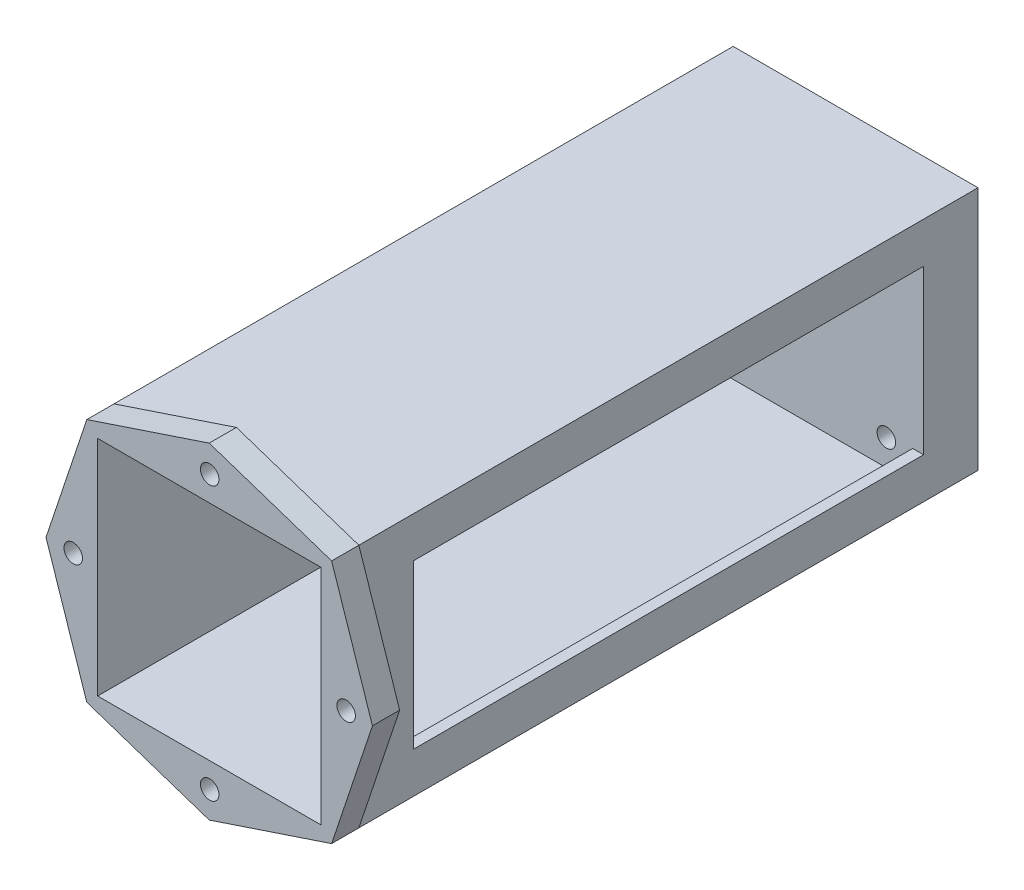
ISO-10303-21;
HEADER;
FILE_DESCRIPTION(('STEP AP214'),'2;1');
FILE_NAME('part.step','',(''),(''),'','','');
FILE_SCHEMA(('AUTOMOTIVE_DESIGN { 1 0 10303 214 1 1 1 1 }'));
ENDSEC;
DATA;
#1=APPLICATION_CONTEXT('core data for automotive mechanical design processes');
#2=APPLICATION_PROTOCOL_DEFINITION('international standard','automotive_design',2000,#1);
#3=PRODUCT_CONTEXT('',#1,'mechanical');
#4=PRODUCT('Part','Part','',(#3));
#5=PRODUCT_RELATED_PRODUCT_CATEGORY('part','',(#4));
#6=PRODUCT_DEFINITION_FORMATION('','',#4);
#7=PRODUCT_DEFINITION_CONTEXT('part definition',#1,'design');
#8=PRODUCT_DEFINITION('design','',#6,#7);
#9=PRODUCT_DEFINITION_SHAPE('','',#8);
#10=(LENGTH_UNIT() NAMED_UNIT(*) SI_UNIT(.MILLI.,.METRE.));
#11=(NAMED_UNIT(*) PLANE_ANGLE_UNIT() SI_UNIT($,.RADIAN.));
#12=(NAMED_UNIT(*) SI_UNIT($,.STERADIAN.) SOLID_ANGLE_UNIT());
#13=UNCERTAINTY_MEASURE_WITH_UNIT(LENGTH_MEASURE(1.E-05),#10,'distance_accuracy_value','');
#14=(GEOMETRIC_REPRESENTATION_CONTEXT(3) GLOBAL_UNCERTAINTY_ASSIGNED_CONTEXT((#13)) GLOBAL_UNIT_ASSIGNED_CONTEXT((#10,
#11,#12)) REPRESENTATION_CONTEXT('',''));
#15=CARTESIAN_POINT('',(0.,0.,0.));
#16=DIRECTION('',(0.,0.,1.));
#17=DIRECTION('',(1.,0.,0.));
#18=AXIS2_PLACEMENT_3D('',#15,#16,#17);
#19=CARTESIAN_POINT('',(0.,0.,-5.));
#20=DIRECTION('',(0.,0.,-1.));
#21=DIRECTION('',(-1.,0.,0.));
#22=AXIS2_PLACEMENT_3D('',#19,#20,#21);
#23=PLANE('',#22);
#24=DIRECTION('',(0.,-1.,0.));
#25=VECTOR('',#24,1.);
#26=CARTESIAN_POINT('',(22.5,22.5,-5.));
#27=LINE('',#26,#25);
#28=CARTESIAN_POINT('',(22.5,22.5,-5.));
#29=VERTEX_POINT('',#28);
#30=CARTESIAN_POINT('',(22.5,-22.5,-5.));
#31=VERTEX_POINT('',#30);
#32=EDGE_CURVE('E174',#29,#31,#27,.T.);
#33=ORIENTED_EDGE('',*,*,#32,.F.);
#34=DIRECTION('',(-0.316227766016838,0.948683298050514,0.));
#35=VECTOR('',#34,1.);
#36=CARTESIAN_POINT('',(22.5,22.5,-5.));
#37=LINE('',#36,#35);
#38=CARTESIAN_POINT('',(30.,0.,-5.));
#39=VERTEX_POINT('',#38);
#40=EDGE_CURVE('E320',#39,#29,#37,.T.);
#41=ORIENTED_EDGE('',*,*,#40,.F.);
#42=DIRECTION('',(0.316227766016838,0.948683298050514,0.));
#43=VECTOR('',#42,1.);
#44=CARTESIAN_POINT('',(30.,0.,-5.));
#45=LINE('',#44,#43);
#46=EDGE_CURVE('E317',#31,#39,#45,.T.);
#47=ORIENTED_EDGE('',*,*,#46,.F.);
#48=EDGE_LOOP('',(#33,#41,#47));
#49=FACE_BOUND('',#48,.T.);
#50=CARTESIAN_POINT('',(25.1687006688977,0.,-5.));
#51=DIRECTION('',(0.,0.,1.));
#52=DIRECTION('',(1.,0.,0.));
#53=AXIS2_PLACEMENT_3D('',#50,#51,#52);
#54=CIRCLE('',#53,1.7);
#55=CARTESIAN_POINT('',(26.8687006688977,0.,-5.));
#56=VERTEX_POINT('',#55);
#57=EDGE_CURVE('E286',#56,#56,#54,.T.);
#58=ORIENTED_EDGE('',*,*,#57,.T.);
#59=EDGE_LOOP('',(#58));
#60=FACE_BOUND('',#59,.T.);
#61=ADVANCED_FACE('F39',(#49,#60),#23,.T.);
#62=DIRECTION('',(1.,0.,0.));
#63=VECTOR('',#62,1.);
#64=CARTESIAN_POINT('',(-22.5,22.5,-5.));
#65=LINE('',#64,#63);
#66=CARTESIAN_POINT('',(-22.5,22.5,-5.));
#67=VERTEX_POINT('',#66);
#68=EDGE_CURVE('E269',#67,#29,#65,.T.);
#69=ORIENTED_EDGE('',*,*,#68,.F.);
#70=DIRECTION('',(-0.948683298050514,-0.316227766016838,0.));
#71=VECTOR('',#70,1.);
#72=CARTESIAN_POINT('',(-22.5,22.5,-5.));
#73=LINE('',#72,#71);
#74=CARTESIAN_POINT('',(0.,30.,-5.));
#75=VERTEX_POINT('',#74);
#76=EDGE_CURVE('E302',#75,#67,#73,.T.);
#77=ORIENTED_EDGE('',*,*,#76,.F.);
#78=DIRECTION('',(-0.948683298050514,0.316227766016838,0.));
#79=VECTOR('',#78,1.);
#80=CARTESIAN_POINT('',(0.,30.,-5.));
#81=LINE('',#80,#79);
#82=EDGE_CURVE('E323',#29,#75,#81,.T.);
#83=ORIENTED_EDGE('',*,*,#82,.F.);
#84=EDGE_LOOP('',(#69,#77,#83));
#85=FACE_BOUND('',#84,.T.);
#86=CARTESIAN_POINT('',(0.0843503344486113,25.0843503344489,-5.));
#87=DIRECTION('',(0.,0.,1.));
#88=DIRECTION('',(1.,0.,0.));
#89=AXIS2_PLACEMENT_3D('',#86,#87,#88);
#90=CIRCLE('',#89,1.7);
#91=CARTESIAN_POINT('',(1.78435033444861,25.0843503344489,-5.));
#92=VERTEX_POINT('',#91);
#93=EDGE_CURVE('E280',#92,#92,#90,.T.);
#94=ORIENTED_EDGE('',*,*,#93,.T.);
#95=EDGE_LOOP('',(#94));
#96=FACE_BOUND('',#95,.T.);
#97=ADVANCED_FACE('F418',(#85,#96),#23,.T.);
#98=DIRECTION('',(0.,1.,0.));
#99=VECTOR('',#98,1.);
#100=CARTESIAN_POINT('',(-22.5,22.5,-5.));
#101=LINE('',#100,#99);
#102=CARTESIAN_POINT('',(-22.5,-22.5,-5.));
#103=VERTEX_POINT('',#102);
#104=EDGE_CURVE('E266',#103,#67,#101,.T.);
#105=ORIENTED_EDGE('',*,*,#104,.F.);
#106=DIRECTION('',(0.316227766016838,-0.948683298050514,0.));
#107=VECTOR('',#106,1.);
#108=CARTESIAN_POINT('',(-22.5,-22.5,-5.));
#109=LINE('',#108,#107);
#110=CARTESIAN_POINT('',(-30.,0.,-5.));
#111=VERTEX_POINT('',#110);
#112=EDGE_CURVE('E309',#111,#103,#109,.T.);
#113=ORIENTED_EDGE('',*,*,#112,.F.);
#114=DIRECTION('',(-0.316227766016838,-0.948683298050514,0.));
#115=VECTOR('',#114,1.);
#116=CARTESIAN_POINT('',(-30.,0.,-5.));
#117=LINE('',#116,#115);
#118=EDGE_CURVE('E305',#67,#111,#117,.T.);
#119=ORIENTED_EDGE('',*,*,#118,.F.);
#120=EDGE_LOOP('',(#105,#113,#119));
#121=FACE_BOUND('',#120,.T.);
#122=CARTESIAN_POINT('',(-25.,0.,-5.));
#123=DIRECTION('',(0.,0.,1.));
#124=DIRECTION('',(1.,0.,0.));
#125=AXIS2_PLACEMENT_3D('',#122,#123,#124);
#126=CIRCLE('',#125,1.7);
#127=CARTESIAN_POINT('',(-23.3,0.,-5.));
#128=VERTEX_POINT('',#127);
#129=EDGE_CURVE('E298',#128,#128,#126,.T.);
#130=ORIENTED_EDGE('',*,*,#129,.T.);
#131=EDGE_LOOP('',(#130));
#132=FACE_BOUND('',#131,.T.);
#133=ADVANCED_FACE('F426',(#121,#132),#23,.T.);
#134=DIRECTION('',(-1.,0.,0.));
#135=VECTOR('',#134,1.);
#136=CARTESIAN_POINT('',(-22.5,-22.5,-5.));
#137=LINE('',#136,#135);
#138=EDGE_CURVE('E264',#31,#103,#137,.T.);
#139=ORIENTED_EDGE('',*,*,#138,.F.);
#140=DIRECTION('',(0.948683298050514,0.316227766016838,0.));
#141=VECTOR('',#140,1.);
#142=CARTESIAN_POINT('',(0.,-30.,-5.));
#143=LINE('',#142,#141);
#144=CARTESIAN_POINT('',(0.,-30.,-5.));
#145=VERTEX_POINT('',#144);
#146=EDGE_CURVE('E314',#145,#31,#143,.T.);
#147=ORIENTED_EDGE('',*,*,#146,.F.);
#148=DIRECTION('',(0.948683298050514,-0.316227766016838,0.));
#149=VECTOR('',#148,1.);
#150=CARTESIAN_POINT('',(-22.5,-22.5,-5.));
#151=LINE('',#150,#149);
#152=EDGE_CURVE('E311',#103,#145,#151,.T.);
#153=ORIENTED_EDGE('',*,*,#152,.F.);
#154=EDGE_LOOP('',(#139,#147,#153));
#155=FACE_BOUND('',#154,.T.);
#156=CARTESIAN_POINT('',(0.0843503344489578,-25.0843503344489,-5.));
#157=DIRECTION('',(0.,0.,1.));
#158=DIRECTION('',(1.,0.,0.));
#159=AXIS2_PLACEMENT_3D('',#156,#157,#158);
#160=CIRCLE('',#159,1.7);
#161=CARTESIAN_POINT('',(1.78435033444896,-25.0843503344489,-5.));
#162=VERTEX_POINT('',#161);
#163=EDGE_CURVE('E292',#162,#162,#160,.T.);
#164=ORIENTED_EDGE('',*,*,#163,.T.);
#165=EDGE_LOOP('',(#164));
#166=FACE_BOUND('',#165,.T.);
#167=ADVANCED_FACE('F421',(#155,#166),#23,.T.);
#168=CARTESIAN_POINT('',(-22.5,22.5,-5.));
#169=DIRECTION('',(-0.316227766016838,0.948683298050514,0.));
#170=DIRECTION('',(-0.948683298050514,-0.316227766016838,0.));
#171=AXIS2_PLACEMENT_3D('',#168,#169,#170);
#172=PLANE('',#171);
#173=DIRECTION('',(-0.948683298050514,-0.316227766016838,0.));
#174=VECTOR('',#173,1.);
#175=CARTESIAN_POINT('',(-22.5,22.5,0.));
#176=LINE('',#175,#174);
#177=CARTESIAN_POINT('',(0.,30.,0.));
#178=VERTEX_POINT('',#177);
#179=CARTESIAN_POINT('',(-22.5,22.5,0.));
#180=VERTEX_POINT('',#179);
#181=EDGE_CURVE('E301',#178,#180,#176,.T.);
#182=ORIENTED_EDGE('',*,*,#181,.F.);
#183=DIRECTION('',(0.,0.,1.));
#184=VECTOR('',#183,1.);
#185=CARTESIAN_POINT('',(0.,30.,-5.));
#186=LINE('',#185,#184);
#187=EDGE_CURVE('E11',#75,#178,#186,.T.);
#188=ORIENTED_EDGE('',*,*,#187,.F.);
#189=ORIENTED_EDGE('',*,*,#76,.T.);
#190=DIRECTION('',(0.,0.,1.));
#191=VECTOR('',#190,1.);
#192=CARTESIAN_POINT('',(-22.5,22.5,-5.));
#193=LINE('',#192,#191);
#194=EDGE_CURVE('E326',#67,#180,#193,.T.);
#195=ORIENTED_EDGE('',*,*,#194,.T.);
#196=EDGE_LOOP('',(#182,#188,#189,#195));
#197=FACE_BOUND('',#196,.T.);
#198=ADVANCED_FACE('F41',(#197),#172,.T.);
#199=CARTESIAN_POINT('',(0.,30.,-5.));
#200=DIRECTION('',(0.316227766016838,0.948683298050514,0.));
#201=DIRECTION('',(-0.948683298050514,0.316227766016838,0.));
#202=AXIS2_PLACEMENT_3D('',#199,#200,#201);
#203=PLANE('',#202);
#204=DIRECTION('',(-0.948683298050514,0.316227766016838,0.));
#205=VECTOR('',#204,1.);
#206=CARTESIAN_POINT('',(0.,30.,0.));
#207=LINE('',#206,#205);
#208=CARTESIAN_POINT('',(22.5,22.5,0.));
#209=VERTEX_POINT('',#208);
#210=EDGE_CURVE('E306',#209,#178,#207,.T.);
#211=ORIENTED_EDGE('',*,*,#210,.F.);
#212=DIRECTION('',(0.,0.,1.));
#213=VECTOR('',#212,1.);
#214=CARTESIAN_POINT('',(22.5,22.5,-5.));
#215=LINE('',#214,#213);
#216=EDGE_CURVE('E48',#29,#209,#215,.T.);
#217=ORIENTED_EDGE('',*,*,#216,.F.);
#218=ORIENTED_EDGE('',*,*,#82,.T.);
#219=ORIENTED_EDGE('',*,*,#187,.T.);
#220=EDGE_LOOP('',(#211,#217,#218,#219));
#221=FACE_BOUND('',#220,.T.);
#222=ADVANCED_FACE('F437',(#221),#203,.T.);
#223=CARTESIAN_POINT('',(22.5,22.5,-5.));
#224=DIRECTION('',(0.948683298050514,0.316227766016838,0.));
#225=DIRECTION('',(-0.316227766016838,0.948683298050514,0.));
#226=AXIS2_PLACEMENT_3D('',#223,#224,#225);
#227=PLANE('',#226);
#228=DIRECTION('',(-0.316227766016838,0.948683298050514,0.));
#229=VECTOR('',#228,1.);
#230=CARTESIAN_POINT('',(22.5,22.5,0.));
#231=LINE('',#230,#229);
#232=CARTESIAN_POINT('',(30.,0.,0.));
#233=VERTEX_POINT('',#232);
#234=EDGE_CURVE('E344',#233,#209,#231,.T.);
#235=ORIENTED_EDGE('',*,*,#234,.F.);
#236=DIRECTION('',(0.,0.,1.));
#237=VECTOR('',#236,1.);
#238=CARTESIAN_POINT('',(30.,0.,-5.));
#239=LINE('',#238,#237);
#240=EDGE_CURVE('E350',#39,#233,#239,.T.);
#241=ORIENTED_EDGE('',*,*,#240,.F.);
#242=ORIENTED_EDGE('',*,*,#40,.T.);
#243=ORIENTED_EDGE('',*,*,#216,.T.);
#244=EDGE_LOOP('',(#235,#241,#242,#243));
#245=FACE_BOUND('',#244,.T.);
#246=ADVANCED_FACE('F637',(#245),#227,.T.);
#247=CARTESIAN_POINT('',(30.,0.,-5.));
#248=DIRECTION('',(0.948683298050514,-0.316227766016838,0.));
#249=DIRECTION('',(0.316227766016838,0.948683298050514,0.));
#250=AXIS2_PLACEMENT_3D('',#247,#248,#249);
#251=PLANE('',#250);
#252=DIRECTION('',(0.316227766016838,0.948683298050514,0.));
#253=VECTOR('',#252,1.);
#254=CARTESIAN_POINT('',(30.,0.,0.));
#255=LINE('',#254,#253);
#256=CARTESIAN_POINT('',(22.5,-22.5,0.));
#257=VERTEX_POINT('',#256);
#258=EDGE_CURVE('E341',#257,#233,#255,.T.);
#259=ORIENTED_EDGE('',*,*,#258,.F.);
#260=DIRECTION('',(0.,0.,1.));
#261=VECTOR('',#260,1.);
#262=CARTESIAN_POINT('',(22.5,-22.5,-5.));
#263=LINE('',#262,#261);
#264=EDGE_CURVE('E352',#31,#257,#263,.T.);
#265=ORIENTED_EDGE('',*,*,#264,.F.);
#266=ORIENTED_EDGE('',*,*,#46,.T.);
#267=ORIENTED_EDGE('',*,*,#240,.T.);
#268=EDGE_LOOP('',(#259,#265,#266,#267));
#269=FACE_BOUND('',#268,.T.);
#270=ADVANCED_FACE('F483',(#269),#251,.T.);
#271=CARTESIAN_POINT('',(0.,-30.,-5.));
#272=DIRECTION('',(0.316227766016838,-0.948683298050514,0.));
#273=DIRECTION('',(0.948683298050514,0.316227766016838,0.));
#274=AXIS2_PLACEMENT_3D('',#271,#272,#273);
#275=PLANE('',#274);
#276=DIRECTION('',(0.948683298050514,0.316227766016838,0.));
#277=VECTOR('',#276,1.);
#278=CARTESIAN_POINT('',(0.,-30.,0.));
#279=LINE('',#278,#277);
#280=CARTESIAN_POINT('',(0.,-30.,0.));
#281=VERTEX_POINT('',#280);
#282=EDGE_CURVE('E338',#281,#257,#279,.T.);
#283=ORIENTED_EDGE('',*,*,#282,.F.);
#284=DIRECTION('',(0.,0.,1.));
#285=VECTOR('',#284,1.);
#286=CARTESIAN_POINT('',(0.,-30.,-5.));
#287=LINE('',#286,#285);
#288=EDGE_CURVE('E354',#145,#281,#287,.T.);
#289=ORIENTED_EDGE('',*,*,#288,.F.);
#290=ORIENTED_EDGE('',*,*,#146,.T.);
#291=ORIENTED_EDGE('',*,*,#264,.T.);
#292=EDGE_LOOP('',(#283,#289,#290,#291));
#293=FACE_BOUND('',#292,.T.);
#294=ADVANCED_FACE('F479',(#293),#275,.T.);
#295=CARTESIAN_POINT('',(-22.5,-22.5,-5.));
#296=DIRECTION('',(-0.316227766016838,-0.948683298050514,0.));
#297=DIRECTION('',(0.948683298050514,-0.316227766016838,0.));
#298=AXIS2_PLACEMENT_3D('',#295,#296,#297);
#299=PLANE('',#298);
#300=DIRECTION('',(0.948683298050514,-0.316227766016838,0.));
#301=VECTOR('',#300,1.);
#302=CARTESIAN_POINT('',(-22.5,-22.5,0.));
#303=LINE('',#302,#301);
#304=CARTESIAN_POINT('',(-22.5,-22.5,0.));
#305=VERTEX_POINT('',#304);
#306=EDGE_CURVE('E335',#305,#281,#303,.T.);
#307=ORIENTED_EDGE('',*,*,#306,.F.);
#308=DIRECTION('',(0.,0.,1.));
#309=VECTOR('',#308,1.);
#310=CARTESIAN_POINT('',(-22.5,-22.5,-5.));
#311=LINE('',#310,#309);
#312=EDGE_CURVE('E356',#103,#305,#311,.T.);
#313=ORIENTED_EDGE('',*,*,#312,.F.);
#314=ORIENTED_EDGE('',*,*,#152,.T.);
#315=ORIENTED_EDGE('',*,*,#288,.T.);
#316=EDGE_LOOP('',(#307,#313,#314,#315));
#317=FACE_BOUND('',#316,.T.);
#318=ADVANCED_FACE('F476',(#317),#299,.T.);
#319=CARTESIAN_POINT('',(-22.5,-22.5,-5.));
#320=DIRECTION('',(-0.948683298050514,-0.316227766016838,0.));
#321=DIRECTION('',(0.316227766016838,-0.948683298050514,0.));
#322=AXIS2_PLACEMENT_3D('',#319,#320,#321);
#323=PLANE('',#322);
#324=DIRECTION('',(0.316227766016838,-0.948683298050514,0.));
#325=VECTOR('',#324,1.);
#326=CARTESIAN_POINT('',(-22.5,-22.5,0.));
#327=LINE('',#326,#325);
#328=CARTESIAN_POINT('',(-30.,0.,0.));
#329=VERTEX_POINT('',#328);
#330=EDGE_CURVE('E332',#329,#305,#327,.T.);
#331=ORIENTED_EDGE('',*,*,#330,.F.);
#332=DIRECTION('',(0.,0.,1.));
#333=VECTOR('',#332,1.);
#334=CARTESIAN_POINT('',(-30.,0.,-5.));
#335=LINE('',#334,#333);
#336=EDGE_CURVE('E358',#111,#329,#335,.T.);
#337=ORIENTED_EDGE('',*,*,#336,.F.);
#338=ORIENTED_EDGE('',*,*,#112,.T.);
#339=ORIENTED_EDGE('',*,*,#312,.T.);
#340=EDGE_LOOP('',(#331,#337,#338,#339));
#341=FACE_BOUND('',#340,.T.);
#342=ADVANCED_FACE('F471',(#341),#323,.T.);
#343=CARTESIAN_POINT('',(-30.,0.,-5.));
#344=DIRECTION('',(-0.948683298050514,0.316227766016838,0.));
#345=DIRECTION('',(-0.316227766016838,-0.948683298050514,0.));
#346=AXIS2_PLACEMENT_3D('',#343,#344,#345);
#347=PLANE('',#346);
#348=DIRECTION('',(-0.316227766016838,-0.948683298050514,0.));
#349=VECTOR('',#348,1.);
#350=CARTESIAN_POINT('',(-30.,0.,0.));
#351=LINE('',#350,#349);
#352=EDGE_CURVE('E329',#180,#329,#351,.T.);
#353=ORIENTED_EDGE('',*,*,#352,.F.);
#354=ORIENTED_EDGE('',*,*,#194,.F.);
#355=ORIENTED_EDGE('',*,*,#118,.T.);
#356=ORIENTED_EDGE('',*,*,#336,.T.);
#357=EDGE_LOOP('',(#353,#354,#355,#356));
#358=FACE_BOUND('',#357,.T.);
#359=ADVANCED_FACE('F457',(#358),#347,.T.);
#360=CARTESIAN_POINT('',(0.,0.,0.));
#361=DIRECTION('',(0.,0.,-1.));
#362=DIRECTION('',(-1.,0.,0.));
#363=AXIS2_PLACEMENT_3D('',#360,#361,#362);
#364=PLANE('',#363);
#365=DIRECTION('',(0.,1.,0.));
#366=VECTOR('',#365,1.);
#367=CARTESIAN_POINT('',(-20.5,-20.5,0.));
#368=LINE('',#367,#366);
#369=CARTESIAN_POINT('',(-20.5,-20.5,0.));
#370=VERTEX_POINT('',#369);
#371=CARTESIAN_POINT('',(-20.5,20.5,0.));
#372=VERTEX_POINT('',#371);
#373=EDGE_CURVE('E238',#370,#372,#368,.T.);
#374=ORIENTED_EDGE('',*,*,#373,.T.);
#375=DIRECTION('',(1.,0.,0.));
#376=VECTOR('',#375,1.);
#377=CARTESIAN_POINT('',(-20.5,20.5,0.));
#378=LINE('',#377,#376);
#379=CARTESIAN_POINT('',(20.5,20.5,0.));
#380=VERTEX_POINT('',#379);
#381=EDGE_CURVE('E230',#372,#380,#378,.T.);
#382=ORIENTED_EDGE('',*,*,#381,.T.);
#383=DIRECTION('',(0.,-1.,0.));
#384=VECTOR('',#383,1.);
#385=CARTESIAN_POINT('',(20.5,20.5,0.));
#386=LINE('',#385,#384);
#387=CARTESIAN_POINT('',(20.5,-20.5,0.));
#388=VERTEX_POINT('',#387);
#389=EDGE_CURVE('E233',#380,#388,#386,.T.);
#390=ORIENTED_EDGE('',*,*,#389,.T.);
#391=DIRECTION('',(-1.,0.,0.));
#392=VECTOR('',#391,1.);
#393=CARTESIAN_POINT('',(20.5,-20.5,0.));
#394=LINE('',#393,#392);
#395=EDGE_CURVE('E64',#388,#370,#394,.T.);
#396=ORIENTED_EDGE('',*,*,#395,.T.);
#397=EDGE_LOOP('',(#374,#382,#390,#396));
#398=FACE_BOUND('',#397,.T.);
#399=CARTESIAN_POINT('',(0.0843503344486113,25.0843503344489,0.));
#400=DIRECTION('',(0.,0.,1.));
#401=DIRECTION('',(1.,0.,0.));
#402=AXIS2_PLACEMENT_3D('',#399,#400,#401);
#403=CIRCLE('',#402,1.69999999999999);
#404=CARTESIAN_POINT('',(1.7843503344486,25.0843503344489,0.));
#405=VERTEX_POINT('',#404);
#406=EDGE_CURVE('E177',#405,#405,#403,.T.);
#407=ORIENTED_EDGE('',*,*,#406,.F.);
#408=EDGE_LOOP('',(#407));
#409=FACE_BOUND('',#408,.T.);
#410=CARTESIAN_POINT('',(25.1687006688977,0.,0.));
#411=DIRECTION('',(0.,0.,1.));
#412=DIRECTION('',(1.,0.,0.));
#413=AXIS2_PLACEMENT_3D('',#410,#411,#412);
#414=CIRCLE('',#413,1.69999999999999);
#415=CARTESIAN_POINT('',(26.8687006688977,0.,0.));
#416=VERTEX_POINT('',#415);
#417=EDGE_CURVE('E283',#416,#416,#414,.T.);
#418=ORIENTED_EDGE('',*,*,#417,.F.);
#419=EDGE_LOOP('',(#418));
#420=FACE_BOUND('',#419,.T.);
#421=CARTESIAN_POINT('',(0.0843503344489578,-25.0843503344489,0.));
#422=DIRECTION('',(0.,0.,1.));
#423=DIRECTION('',(1.,0.,0.));
#424=AXIS2_PLACEMENT_3D('',#421,#422,#423);
#425=CIRCLE('',#424,1.69999999999999);
#426=CARTESIAN_POINT('',(1.78435033444895,-25.0843503344489,0.));
#427=VERTEX_POINT('',#426);
#428=EDGE_CURVE('E289',#427,#427,#425,.T.);
#429=ORIENTED_EDGE('',*,*,#428,.F.);
#430=EDGE_LOOP('',(#429));
#431=FACE_BOUND('',#430,.T.);
#432=CARTESIAN_POINT('',(-25.,0.,0.));
#433=DIRECTION('',(0.,0.,1.));
#434=DIRECTION('',(1.,0.,0.));
#435=AXIS2_PLACEMENT_3D('',#432,#433,#434);
#436=CIRCLE('',#435,1.69999999999999);
#437=CARTESIAN_POINT('',(-23.3,0.,0.));
#438=VERTEX_POINT('',#437);
#439=EDGE_CURVE('E295',#438,#438,#436,.T.);
#440=ORIENTED_EDGE('',*,*,#439,.F.);
#441=EDGE_LOOP('',(#440));
#442=FACE_BOUND('',#441,.T.);
#443=ORIENTED_EDGE('',*,*,#181,.T.);
#444=ORIENTED_EDGE('',*,*,#352,.T.);
#445=ORIENTED_EDGE('',*,*,#330,.T.);
#446=ORIENTED_EDGE('',*,*,#306,.T.);
#447=ORIENTED_EDGE('',*,*,#282,.T.);
#448=ORIENTED_EDGE('',*,*,#258,.T.);
#449=ORIENTED_EDGE('',*,*,#234,.T.);
#450=ORIENTED_EDGE('',*,*,#210,.T.);
#451=EDGE_LOOP('',(#443,#444,#445,#446,#447,#448,#449,#450));
#452=FACE_BOUND('',#451,.T.);
#453=ADVANCED_FACE('F454',(#398,#409,#420,#431,#442,#452),#364,.F.);
#454=CARTESIAN_POINT('',(-25.,0.,0.));
#455=DIRECTION('',(0.,0.,1.));
#456=DIRECTION('',(1.,0.,0.));
#457=AXIS2_PLACEMENT_3D('',#454,#455,#456);
#458=CYLINDRICAL_SURFACE('',#457,1.69999999999999);
#459=ORIENTED_EDGE('',*,*,#129,.F.);
#460=EDGE_LOOP('',(#459));
#461=FACE_BOUND('',#460,.T.);
#462=ORIENTED_EDGE('',*,*,#439,.T.);
#463=EDGE_LOOP('',(#462));
#464=FACE_BOUND('',#463,.T.);
#465=ADVANCED_FACE('F450',(#461,#464),#458,.F.);
#466=CARTESIAN_POINT('',(0.0843503344489578,-25.0843503344489,0.));
#467=DIRECTION('',(0.,0.,1.));
#468=DIRECTION('',(1.,0.,0.));
#469=AXIS2_PLACEMENT_3D('',#466,#467,#468);
#470=CYLINDRICAL_SURFACE('',#469,1.69999999999999);
#471=ORIENTED_EDGE('',*,*,#163,.F.);
#472=EDGE_LOOP('',(#471));
#473=FACE_BOUND('',#472,.T.);
#474=ORIENTED_EDGE('',*,*,#428,.T.);
#475=EDGE_LOOP('',(#474));
#476=FACE_BOUND('',#475,.T.);
#477=ADVANCED_FACE('F446',(#473,#476),#470,.F.);
#478=CARTESIAN_POINT('',(25.1687006688977,0.,0.));
#479=DIRECTION('',(0.,0.,1.));
#480=DIRECTION('',(1.,0.,0.));
#481=AXIS2_PLACEMENT_3D('',#478,#479,#480);
#482=CYLINDRICAL_SURFACE('',#481,1.69999999999999);
#483=ORIENTED_EDGE('',*,*,#57,.F.);
#484=EDGE_LOOP('',(#483));
#485=FACE_BOUND('',#484,.T.);
#486=ORIENTED_EDGE('',*,*,#417,.T.);
#487=EDGE_LOOP('',(#486));
#488=FACE_BOUND('',#487,.T.);
#489=ADVANCED_FACE('F449',(#485,#488),#482,.F.);
#490=CARTESIAN_POINT('',(0.0843503344486113,25.0843503344489,0.));
#491=DIRECTION('',(0.,0.,1.));
#492=DIRECTION('',(1.,0.,0.));
#493=AXIS2_PLACEMENT_3D('',#490,#491,#492);
#494=CYLINDRICAL_SURFACE('',#493,1.69999999999999);
#495=ORIENTED_EDGE('',*,*,#93,.F.);
#496=EDGE_LOOP('',(#495));
#497=FACE_BOUND('',#496,.T.);
#498=ORIENTED_EDGE('',*,*,#406,.T.);
#499=EDGE_LOOP('',(#498));
#500=FACE_BOUND('',#499,.T.);
#501=ADVANCED_FACE('F505',(#497,#500),#494,.F.);
#502=CARTESIAN_POINT('',(22.5,22.5,-108.8));
#503=DIRECTION('',(-1.,0.,0.));
#504=DIRECTION('',(0.,0.,1.));
#505=AXIS2_PLACEMENT_3D('',#502,#503,#504);
#506=PLANE('',#505);
#507=DIRECTION('',(0.,0.,1.));
#508=VECTOR('',#507,1.);
#509=CARTESIAN_POINT('',(22.5,-22.5,-108.8));
#510=LINE('',#509,#508);
#511=CARTESIAN_POINT('',(22.5,-22.5,-118.8));
#512=VERTEX_POINT('',#511);
#513=EDGE_CURVE('E167',#512,#31,#510,.T.);
#514=ORIENTED_EDGE('',*,*,#513,.F.);
#515=DIRECTION('',(0.,-1.,0.));
#516=VECTOR('',#515,1.);
#517=CARTESIAN_POINT('',(22.5,-22.5,-118.8));
#518=LINE('',#517,#516);
#519=CARTESIAN_POINT('',(22.5,22.5,-118.8));
#520=VERTEX_POINT('',#519);
#521=EDGE_CURVE('E173',#520,#512,#518,.T.);
#522=ORIENTED_EDGE('',*,*,#521,.F.);
#523=DIRECTION('',(0.,0.,1.));
#524=VECTOR('',#523,1.);
#525=CARTESIAN_POINT('',(22.5,22.5,-108.8));
#526=LINE('',#525,#524);
#527=EDGE_CURVE('E272',#520,#29,#526,.T.);
#528=ORIENTED_EDGE('',*,*,#527,.T.);
#529=ORIENTED_EDGE('',*,*,#32,.T.);
#530=EDGE_LOOP('',(#514,#522,#528,#529));
#531=FACE_BOUND('',#530,.T.);
#532=DIRECTION('',(0.,-1.,0.));
#533=VECTOR('',#532,1.);
#534=CARTESIAN_POINT('',(22.5,-22.5,-108.8));
#535=LINE('',#534,#533);
#536=CARTESIAN_POINT('',(22.5,15.,-108.8));
#537=VERTEX_POINT('',#536);
#538=CARTESIAN_POINT('',(22.5,-15.,-108.8));
#539=VERTEX_POINT('',#538);
#540=EDGE_CURVE('E193',#537,#539,#535,.T.);
#541=ORIENTED_EDGE('',*,*,#540,.T.);
#542=DIRECTION('',(0.,0.,-1.));
#543=VECTOR('',#542,1.);
#544=CARTESIAN_POINT('',(22.5,-15.,-108.8));
#545=LINE('',#544,#543);
#546=CARTESIAN_POINT('',(22.5,-15.,-15.));
#547=VERTEX_POINT('',#546);
#548=EDGE_CURVE('E206',#547,#539,#545,.T.);
#549=ORIENTED_EDGE('',*,*,#548,.F.);
#550=DIRECTION('',(0.,-1.,0.));
#551=VECTOR('',#550,1.);
#552=CARTESIAN_POINT('',(22.5,-15.,-15.));
#553=LINE('',#552,#551);
#554=CARTESIAN_POINT('',(22.5,15.,-15.));
#555=VERTEX_POINT('',#554);
#556=EDGE_CURVE('E210',#555,#547,#553,.T.);
#557=ORIENTED_EDGE('',*,*,#556,.F.);
#558=DIRECTION('',(0.,0.,1.));
#559=VECTOR('',#558,1.);
#560=CARTESIAN_POINT('',(22.5,15.,-108.8));
#561=LINE('',#560,#559);
#562=EDGE_CURVE('E213',#537,#555,#561,.T.);
#563=ORIENTED_EDGE('',*,*,#562,.F.);
#564=EDGE_LOOP('',(#541,#549,#557,#563));
#565=FACE_BOUND('',#564,.T.);
#566=ADVANCED_FACE('F169',(#531,#565),#506,.F.);
#567=CARTESIAN_POINT('',(-22.5,-22.5,-108.8));
#568=DIRECTION('',(0.,1.,0.));
#569=DIRECTION('',(0.,0.,1.));
#570=AXIS2_PLACEMENT_3D('',#567,#568,#569);
#571=PLANE('',#570);
#572=ORIENTED_EDGE('',*,*,#138,.T.);
#573=DIRECTION('',(0.,0.,1.));
#574=VECTOR('',#573,1.);
#575=CARTESIAN_POINT('',(-22.5,-22.5,-108.8));
#576=LINE('',#575,#574);
#577=CARTESIAN_POINT('',(-22.5,-22.5,-118.8));
#578=VERTEX_POINT('',#577);
#579=EDGE_CURVE('E178',#578,#103,#576,.T.);
#580=ORIENTED_EDGE('',*,*,#579,.F.);
#581=DIRECTION('',(-1.,0.,0.));
#582=VECTOR('',#581,1.);
#583=CARTESIAN_POINT('',(22.5,-22.5,-118.8));
#584=LINE('',#583,#582);
#585=EDGE_CURVE('E181',#512,#578,#584,.T.);
#586=ORIENTED_EDGE('',*,*,#585,.F.);
#587=ORIENTED_EDGE('',*,*,#513,.T.);
#588=EDGE_LOOP('',(#572,#580,#586,#587));
#589=FACE_BOUND('',#588,.T.);
#590=ADVANCED_FACE('F182',(#589),#571,.F.);
#591=CARTESIAN_POINT('',(-22.5,22.5,-108.8));
#592=DIRECTION('',(1.,0.,0.));
#593=DIRECTION('',(0.,0.,-1.));
#594=AXIS2_PLACEMENT_3D('',#591,#592,#593);
#595=PLANE('',#594);
#596=ORIENTED_EDGE('',*,*,#104,.T.);
#597=DIRECTION('',(0.,0.,1.));
#598=VECTOR('',#597,1.);
#599=CARTESIAN_POINT('',(-22.5,22.5,-108.8));
#600=LINE('',#599,#598);
#601=CARTESIAN_POINT('',(-22.5,22.5,-118.8));
#602=VERTEX_POINT('',#601);
#603=EDGE_CURVE('E274',#602,#67,#600,.T.);
#604=ORIENTED_EDGE('',*,*,#603,.F.);
#605=DIRECTION('',(0.,1.,0.));
#606=VECTOR('',#605,1.);
#607=CARTESIAN_POINT('',(-22.5,-22.5,-118.8));
#608=LINE('',#607,#606);
#609=EDGE_CURVE('E187',#578,#602,#608,.T.);
#610=ORIENTED_EDGE('',*,*,#609,.F.);
#611=ORIENTED_EDGE('',*,*,#579,.T.);
#612=EDGE_LOOP('',(#596,#604,#610,#611));
#613=FACE_BOUND('',#612,.T.);
#614=ADVANCED_FACE('F493',(#613),#595,.F.);
#615=CARTESIAN_POINT('',(-22.5,22.5,-108.8));
#616=DIRECTION('',(0.,-1.,0.));
#617=DIRECTION('',(0.,0.,-1.));
#618=AXIS2_PLACEMENT_3D('',#615,#616,#617);
#619=PLANE('',#618);
#620=ORIENTED_EDGE('',*,*,#68,.T.);
#621=ORIENTED_EDGE('',*,*,#527,.F.);
#622=DIRECTION('',(1.,0.,0.));
#623=VECTOR('',#622,1.);
#624=CARTESIAN_POINT('',(22.5,22.5,-118.8));
#625=LINE('',#624,#623);
#626=EDGE_CURVE('E192',#602,#520,#625,.T.);
#627=ORIENTED_EDGE('',*,*,#626,.F.);
#628=ORIENTED_EDGE('',*,*,#603,.T.);
#629=EDGE_LOOP('',(#620,#621,#627,#628));
#630=FACE_BOUND('',#629,.T.);
#631=ADVANCED_FACE('F491',(#630),#619,.F.);
#632=CARTESIAN_POINT('',(-20.5,20.5,0.));
#633=DIRECTION('',(0.,1.,0.));
#634=DIRECTION('',(0.,0.,1.));
#635=AXIS2_PLACEMENT_3D('',#632,#633,#634);
#636=PLANE('',#635);
#637=DIRECTION('',(1.,0.,0.));
#638=VECTOR('',#637,1.);
#639=CARTESIAN_POINT('',(-20.5,20.5,-108.8));
#640=LINE('',#639,#638);
#641=CARTESIAN_POINT('',(-20.5,20.5,-108.8));
#642=VERTEX_POINT('',#641);
#643=CARTESIAN_POINT('',(20.5,20.5,-108.8));
#644=VERTEX_POINT('',#643);
#645=EDGE_CURVE('E229',#642,#644,#640,.T.);
#646=ORIENTED_EDGE('',*,*,#645,.T.);
#647=DIRECTION('',(0.,0.,-1.));
#648=VECTOR('',#647,1.);
#649=CARTESIAN_POINT('',(20.5,20.5,0.));
#650=LINE('',#649,#648);
#651=EDGE_CURVE('E241',#380,#644,#650,.T.);
#652=ORIENTED_EDGE('',*,*,#651,.F.);
#653=ORIENTED_EDGE('',*,*,#381,.F.);
#654=DIRECTION('',(0.,0.,-1.));
#655=VECTOR('',#654,1.);
#656=CARTESIAN_POINT('',(-20.5,20.5,0.));
#657=LINE('',#656,#655);
#658=EDGE_CURVE('E253',#372,#642,#657,.T.);
#659=ORIENTED_EDGE('',*,*,#658,.T.);
#660=EDGE_LOOP('',(#646,#652,#653,#659));
#661=FACE_BOUND('',#660,.T.);
#662=ADVANCED_FACE('F517',(#661),#636,.F.);
#663=CARTESIAN_POINT('',(-20.5,-20.5,0.));
#664=DIRECTION('',(-1.,0.,0.));
#665=DIRECTION('',(0.,0.,1.));
#666=AXIS2_PLACEMENT_3D('',#663,#664,#665);
#667=PLANE('',#666);
#668=DIRECTION('',(0.,1.,0.));
#669=VECTOR('',#668,1.);
#670=CARTESIAN_POINT('',(-20.5,-20.5,-108.8));
#671=LINE('',#670,#669);
#672=CARTESIAN_POINT('',(-20.5,-20.5,-108.8));
#673=VERTEX_POINT('',#672);
#674=EDGE_CURVE('E234',#673,#642,#671,.T.);
#675=ORIENTED_EDGE('',*,*,#674,.T.);
#676=ORIENTED_EDGE('',*,*,#658,.F.);
#677=ORIENTED_EDGE('',*,*,#373,.F.);
#678=DIRECTION('',(0.,0.,-1.));
#679=VECTOR('',#678,1.);
#680=CARTESIAN_POINT('',(-20.5,-20.5,0.));
#681=LINE('',#680,#679);
#682=EDGE_CURVE('E256',#370,#673,#681,.T.);
#683=ORIENTED_EDGE('',*,*,#682,.T.);
#684=EDGE_LOOP('',(#675,#676,#677,#683));
#685=FACE_BOUND('',#684,.T.);
#686=ADVANCED_FACE('F520',(#685),#667,.F.);
#687=CARTESIAN_POINT('',(20.5,-20.5,0.));
#688=DIRECTION('',(0.,-1.,0.));
#689=DIRECTION('',(0.,0.,-1.));
#690=AXIS2_PLACEMENT_3D('',#687,#688,#689);
#691=PLANE('',#690);
#692=DIRECTION('',(-1.,0.,0.));
#693=VECTOR('',#692,1.);
#694=CARTESIAN_POINT('',(20.5,-20.5,-108.8));
#695=LINE('',#694,#693);
#696=CARTESIAN_POINT('',(20.5,-20.5,-108.8));
#697=VERTEX_POINT('',#696);
#698=EDGE_CURVE('E248',#697,#673,#695,.T.);
#699=ORIENTED_EDGE('',*,*,#698,.T.);
#700=ORIENTED_EDGE('',*,*,#682,.F.);
#701=ORIENTED_EDGE('',*,*,#395,.F.);
#702=DIRECTION('',(0.,0.,-1.));
#703=VECTOR('',#702,1.);
#704=CARTESIAN_POINT('',(20.5,-20.5,0.));
#705=LINE('',#704,#703);
#706=EDGE_CURVE('E259',#388,#697,#705,.T.);
#707=ORIENTED_EDGE('',*,*,#706,.T.);
#708=EDGE_LOOP('',(#699,#700,#701,#707));
#709=FACE_BOUND('',#708,.T.);
#710=ADVANCED_FACE('F526',(#709),#691,.F.);
#711=CARTESIAN_POINT('',(20.5,20.5,0.));
#712=DIRECTION('',(1.,0.,0.));
#713=DIRECTION('',(0.,0.,-1.));
#714=AXIS2_PLACEMENT_3D('',#711,#712,#713);
#715=PLANE('',#714);
#716=DIRECTION('',(0.,1.,0.));
#717=VECTOR('',#716,1.);
#718=CARTESIAN_POINT('',(20.5,-15.,-15.));
#719=LINE('',#718,#717);
#720=CARTESIAN_POINT('',(20.5,-15.,-15.));
#721=VERTEX_POINT('',#720);
#722=CARTESIAN_POINT('',(20.5,15.,-15.));
#723=VERTEX_POINT('',#722);
#724=EDGE_CURVE('E56',#721,#723,#719,.T.);
#725=ORIENTED_EDGE('',*,*,#724,.F.);
#726=DIRECTION('',(0.,0.,1.));
#727=VECTOR('',#726,1.);
#728=CARTESIAN_POINT('',(20.5,-15.,-108.8));
#729=LINE('',#728,#727);
#730=CARTESIAN_POINT('',(20.5,-15.,-108.8));
#731=VERTEX_POINT('',#730);
#732=EDGE_CURVE('E216',#731,#721,#729,.T.);
#733=ORIENTED_EDGE('',*,*,#732,.F.);
#734=DIRECTION('',(0.,-1.,0.));
#735=VECTOR('',#734,1.);
#736=CARTESIAN_POINT('',(20.5,20.5,-108.8));
#737=LINE('',#736,#735);
#738=EDGE_CURVE('E244',#731,#697,#737,.T.);
#739=ORIENTED_EDGE('',*,*,#738,.T.);
#740=ORIENTED_EDGE('',*,*,#706,.F.);
#741=ORIENTED_EDGE('',*,*,#389,.F.);
#742=ORIENTED_EDGE('',*,*,#651,.T.);
#743=CARTESIAN_POINT('',(20.5,15.,-108.8));
#744=VERTEX_POINT('',#743);
#745=EDGE_CURVE('E245',#644,#744,#737,.T.);
#746=ORIENTED_EDGE('',*,*,#745,.T.);
#747=DIRECTION('',(0.,0.,-1.));
#748=VECTOR('',#747,1.);
#749=CARTESIAN_POINT('',(20.5,15.,-108.8));
#750=LINE('',#749,#748);
#751=EDGE_CURVE('E205',#723,#744,#750,.T.);
#752=ORIENTED_EDGE('',*,*,#751,.F.);
#753=EDGE_LOOP('',(#725,#733,#739,#740,#741,#742,#746,#752));
#754=FACE_BOUND('',#753,.T.);
#755=ADVANCED_FACE('F522',(#754),#715,.F.);
#756=CARTESIAN_POINT('',(-30.001,-15.,-15.));
#757=DIRECTION('',(0.,0.,1.));
#758=DIRECTION('',(1.,0.,0.));
#759=AXIS2_PLACEMENT_3D('',#756,#757,#758);
#760=PLANE('',#759);
#761=ORIENTED_EDGE('',*,*,#724,.T.);
#762=DIRECTION('',(1.,0.,0.));
#763=VECTOR('',#762,1.);
#764=CARTESIAN_POINT('',(-30.001,15.,-15.));
#765=LINE('',#764,#763);
#766=EDGE_CURVE('E224',#723,#555,#765,.T.);
#767=ORIENTED_EDGE('',*,*,#766,.T.);
#768=ORIENTED_EDGE('',*,*,#556,.T.);
#769=DIRECTION('',(1.,0.,0.));
#770=VECTOR('',#769,1.);
#771=CARTESIAN_POINT('',(-30.001,-15.,-15.));
#772=LINE('',#771,#770);
#773=EDGE_CURVE('E209',#721,#547,#772,.T.);
#774=ORIENTED_EDGE('',*,*,#773,.F.);
#775=EDGE_LOOP('',(#761,#767,#768,#774));
#776=FACE_BOUND('',#775,.T.);
#777=ADVANCED_FACE('F525',(#776),#760,.F.);
#778=CARTESIAN_POINT('',(-30.001,-15.,-108.8));
#779=DIRECTION('',(0.,-1.,0.));
#780=DIRECTION('',(0.,0.,-1.));
#781=AXIS2_PLACEMENT_3D('',#778,#779,#780);
#782=PLANE('',#781);
#783=ORIENTED_EDGE('',*,*,#732,.T.);
#784=ORIENTED_EDGE('',*,*,#773,.T.);
#785=ORIENTED_EDGE('',*,*,#548,.T.);
#786=DIRECTION('',(1.,0.,0.));
#787=VECTOR('',#786,1.);
#788=CARTESIAN_POINT('',(-30.001,-15.,-108.8));
#789=LINE('',#788,#787);
#790=EDGE_CURVE('E225',#731,#539,#789,.T.);
#791=ORIENTED_EDGE('',*,*,#790,.F.);
#792=EDGE_LOOP('',(#783,#784,#785,#791));
#793=FACE_BOUND('',#792,.T.);
#794=ADVANCED_FACE('F535',(#793),#782,.F.);
#795=CARTESIAN_POINT('',(-30.001,15.,-108.8));
#796=DIRECTION('',(0.,1.,0.));
#797=DIRECTION('',(0.,0.,1.));
#798=AXIS2_PLACEMENT_3D('',#795,#796,#797);
#799=PLANE('',#798);
#800=ORIENTED_EDGE('',*,*,#751,.T.);
#801=DIRECTION('',(1.,0.,0.));
#802=VECTOR('',#801,1.);
#803=CARTESIAN_POINT('',(-30.001,15.,-108.8));
#804=LINE('',#803,#802);
#805=EDGE_CURVE('E221',#744,#537,#804,.T.);
#806=ORIENTED_EDGE('',*,*,#805,.T.);
#807=ORIENTED_EDGE('',*,*,#562,.T.);
#808=ORIENTED_EDGE('',*,*,#766,.F.);
#809=EDGE_LOOP('',(#800,#806,#807,#808));
#810=FACE_BOUND('',#809,.T.);
#811=ADVANCED_FACE('F394',(#810),#799,.F.);
#812=CARTESIAN_POINT('',(0.,0.,-118.8));
#813=DIRECTION('',(0.,0.,1.));
#814=DIRECTION('',(1.,0.,0.));
#815=AXIS2_PLACEMENT_3D('',#812,#813,#814);
#816=PLANE('',#815);
#817=CARTESIAN_POINT('',(0.,0.,-118.8));
#818=DIRECTION('',(0.,0.,-1.));
#819=DIRECTION('',(-1.,0.,0.));
#820=AXIS2_PLACEMENT_3D('',#817,#818,#819);
#821=CIRCLE('',#820,2.74999999999999);
#822=CARTESIAN_POINT('',(-2.74999999999999,0.,-118.8));
#823=VERTEX_POINT('',#822);
#824=EDGE_CURVE('E385',#823,#823,#821,.T.);
#825=ORIENTED_EDGE('',*,*,#824,.F.);
#826=EDGE_LOOP('',(#825));
#827=FACE_BOUND('',#826,.T.);
#828=CARTESIAN_POINT('',(-15.5200000000002,-15.6597963919677,-118.8));
#829=DIRECTION('',(0.,0.,-1.));
#830=DIRECTION('',(-1.,0.,0.));
#831=AXIS2_PLACEMENT_3D('',#828,#829,#830);
#832=CIRCLE('',#831,1.69999999999999);
#833=CARTESIAN_POINT('',(-17.2200000000002,-15.6597963919677,-118.8));
#834=VERTEX_POINT('',#833);
#835=EDGE_CURVE('E379',#834,#834,#832,.T.);
#836=ORIENTED_EDGE('',*,*,#835,.F.);
#837=EDGE_LOOP('',(#836));
#838=FACE_BOUND('',#837,.T.);
#839=CARTESIAN_POINT('',(15.6597963919678,-15.6597963919678,-118.8));
#840=DIRECTION('',(0.,0.,-1.));
#841=DIRECTION('',(-1.,0.,0.));
#842=AXIS2_PLACEMENT_3D('',#839,#840,#841);
#843=CIRCLE('',#842,1.69999999999999);
#844=CARTESIAN_POINT('',(13.9597963919679,-15.6597963919678,-118.8));
#845=VERTEX_POINT('',#844);
#846=EDGE_CURVE('E372',#845,#845,#843,.T.);
#847=ORIENTED_EDGE('',*,*,#846,.F.);
#848=EDGE_LOOP('',(#847));
#849=FACE_BOUND('',#848,.T.);
#850=CARTESIAN_POINT('',(15.6597963919679,15.5199999999999,-118.8));
#851=DIRECTION('',(0.,0.,-1.));
#852=DIRECTION('',(-1.,0.,0.));
#853=AXIS2_PLACEMENT_3D('',#850,#851,#852);
#854=CIRCLE('',#853,1.69999999999999);
#855=CARTESIAN_POINT('',(13.9597963919679,15.5199999999999,-118.8));
#856=VERTEX_POINT('',#855);
#857=EDGE_CURVE('E364',#856,#856,#854,.T.);
#858=ORIENTED_EDGE('',*,*,#857,.F.);
#859=EDGE_LOOP('',(#858));
#860=FACE_BOUND('',#859,.T.);
#861=CARTESIAN_POINT('',(-15.52,15.52,-118.8));
#862=DIRECTION('',(0.,0.,-1.));
#863=DIRECTION('',(-1.,0.,0.));
#864=AXIS2_PLACEMENT_3D('',#861,#862,#863);
#865=CIRCLE('',#864,1.69999999999999);
#866=CARTESIAN_POINT('',(-17.22,15.52,-118.8));
#867=VERTEX_POINT('',#866);
#868=EDGE_CURVE('E199',#867,#867,#865,.T.);
#869=ORIENTED_EDGE('',*,*,#868,.F.);
#870=EDGE_LOOP('',(#869));
#871=FACE_BOUND('',#870,.T.);
#872=ORIENTED_EDGE('',*,*,#521,.T.);
#873=ORIENTED_EDGE('',*,*,#585,.T.);
#874=ORIENTED_EDGE('',*,*,#609,.T.);
#875=ORIENTED_EDGE('',*,*,#626,.T.);
#876=EDGE_LOOP('',(#872,#873,#874,#875));
#877=FACE_BOUND('',#876,.T.);
#878=ADVANCED_FACE('F190',(#827,#838,#849,#860,#871,#877),#816,.F.);
#879=CARTESIAN_POINT('',(0.,0.,-108.8));
#880=DIRECTION('',(0.,0.,1.));
#881=DIRECTION('',(1.,0.,0.));
#882=AXIS2_PLACEMENT_3D('',#879,#880,#881);
#883=PLANE('',#882);
#884=CARTESIAN_POINT('',(0.,0.,-108.8));
#885=DIRECTION('',(0.,0.,1.));
#886=DIRECTION('',(1.,0.,0.));
#887=AXIS2_PLACEMENT_3D('',#884,#885,#886);
#888=CIRCLE('',#887,2.74999999999998);
#889=CARTESIAN_POINT('',(2.74999999999998,0.,-108.8));
#890=VERTEX_POINT('',#889);
#891=EDGE_CURVE('E382',#890,#890,#888,.T.);
#892=ORIENTED_EDGE('',*,*,#891,.F.);
#893=EDGE_LOOP('',(#892));
#894=FACE_BOUND('',#893,.T.);
#895=CARTESIAN_POINT('',(-15.5200000000002,-15.6597963919677,-108.8));
#896=DIRECTION('',(0.,0.,1.));
#897=DIRECTION('',(1.,0.,0.));
#898=AXIS2_PLACEMENT_3D('',#895,#896,#897);
#899=CIRCLE('',#898,1.69999999999999);
#900=CARTESIAN_POINT('',(-13.8200000000002,-15.6597963919677,-108.8));
#901=VERTEX_POINT('',#900);
#902=EDGE_CURVE('E376',#901,#901,#899,.T.);
#903=ORIENTED_EDGE('',*,*,#902,.F.);
#904=EDGE_LOOP('',(#903));
#905=FACE_BOUND('',#904,.T.);
#906=CARTESIAN_POINT('',(15.6597963919678,-15.6597963919678,-108.8));
#907=DIRECTION('',(0.,0.,1.));
#908=DIRECTION('',(1.,0.,0.));
#909=AXIS2_PLACEMENT_3D('',#906,#907,#908);
#910=CIRCLE('',#909,1.69999999999999);
#911=CARTESIAN_POINT('',(17.3597963919678,-15.6597963919678,-108.8));
#912=VERTEX_POINT('',#911);
#913=EDGE_CURVE('E43',#912,#912,#910,.T.);
#914=ORIENTED_EDGE('',*,*,#913,.F.);
#915=EDGE_LOOP('',(#914));
#916=FACE_BOUND('',#915,.T.);
#917=CARTESIAN_POINT('',(15.6597963919679,15.5199999999999,-108.8));
#918=DIRECTION('',(0.,0.,1.));
#919=DIRECTION('',(1.,0.,0.));
#920=AXIS2_PLACEMENT_3D('',#917,#918,#919);
#921=CIRCLE('',#920,1.69999999999998);
#922=CARTESIAN_POINT('',(17.3597963919679,15.5199999999999,-108.8));
#923=VERTEX_POINT('',#922);
#924=EDGE_CURVE('E362',#923,#923,#921,.T.);
#925=ORIENTED_EDGE('',*,*,#924,.F.);
#926=EDGE_LOOP('',(#925));
#927=FACE_BOUND('',#926,.T.);
#928=CARTESIAN_POINT('',(-15.52,15.52,-108.8));
#929=DIRECTION('',(0.,0.,1.));
#930=DIRECTION('',(1.,0.,0.));
#931=AXIS2_PLACEMENT_3D('',#928,#929,#930);
#932=CIRCLE('',#931,1.69999999999999);
#933=CARTESIAN_POINT('',(-13.82,15.52,-108.8));
#934=VERTEX_POINT('',#933);
#935=EDGE_CURVE('E196',#934,#934,#932,.T.);
#936=ORIENTED_EDGE('',*,*,#935,.F.);
#937=EDGE_LOOP('',(#936));
#938=FACE_BOUND('',#937,.T.);
#939=ORIENTED_EDGE('',*,*,#738,.F.);
#940=ORIENTED_EDGE('',*,*,#790,.T.);
#941=ORIENTED_EDGE('',*,*,#540,.F.);
#942=ORIENTED_EDGE('',*,*,#805,.F.);
#943=ORIENTED_EDGE('',*,*,#745,.F.);
#944=ORIENTED_EDGE('',*,*,#645,.F.);
#945=ORIENTED_EDGE('',*,*,#674,.F.);
#946=ORIENTED_EDGE('',*,*,#698,.F.);
#947=EDGE_LOOP('',(#939,#940,#941,#942,#943,#944,#945,#946));
#948=FACE_BOUND('',#947,.T.);
#949=ADVANCED_FACE('F393',(#894,#905,#916,#927,#938,#948),#883,.T.);
#950=CARTESIAN_POINT('',(-15.52,15.52,-118.8));
#951=DIRECTION('',(0.,0.,-1.));
#952=DIRECTION('',(-1.,0.,0.));
#953=AXIS2_PLACEMENT_3D('',#950,#951,#952);
#954=CYLINDRICAL_SURFACE('',#953,1.69999999999999);
#955=ORIENTED_EDGE('',*,*,#935,.T.);
#956=EDGE_LOOP('',(#955));
#957=FACE_BOUND('',#956,.T.);
#958=ORIENTED_EDGE('',*,*,#868,.T.);
#959=EDGE_LOOP('',(#958));
#960=FACE_BOUND('',#959,.T.);
#961=ADVANCED_FACE('F403',(#957,#960),#954,.F.);
#962=CARTESIAN_POINT('',(15.6597963919679,15.5199999999999,-118.8));
#963=DIRECTION('',(0.,0.,-1.));
#964=DIRECTION('',(-1.,0.,0.));
#965=AXIS2_PLACEMENT_3D('',#962,#963,#964);
#966=CYLINDRICAL_SURFACE('',#965,1.69999999999998);
#967=ORIENTED_EDGE('',*,*,#924,.T.);
#968=EDGE_LOOP('',(#967));
#969=FACE_BOUND('',#968,.T.);
#970=ORIENTED_EDGE('',*,*,#857,.T.);
#971=EDGE_LOOP('',(#970));
#972=FACE_BOUND('',#971,.T.);
#973=ADVANCED_FACE('F405',(#969,#972),#966,.F.);
#974=CARTESIAN_POINT('',(15.6597963919678,-15.6597963919678,-118.8));
#975=DIRECTION('',(0.,0.,-1.));
#976=DIRECTION('',(-1.,0.,0.));
#977=AXIS2_PLACEMENT_3D('',#974,#975,#976);
#978=CYLINDRICAL_SURFACE('',#977,1.69999999999999);
#979=ORIENTED_EDGE('',*,*,#913,.T.);
#980=EDGE_LOOP('',(#979));
#981=FACE_BOUND('',#980,.T.);
#982=ORIENTED_EDGE('',*,*,#846,.T.);
#983=EDGE_LOOP('',(#982));
#984=FACE_BOUND('',#983,.T.);
#985=ADVANCED_FACE('F412',(#981,#984),#978,.F.);
#986=CARTESIAN_POINT('',(-15.5200000000002,-15.6597963919677,-118.8));
#987=DIRECTION('',(0.,0.,-1.));
#988=DIRECTION('',(-1.,0.,0.));
#989=AXIS2_PLACEMENT_3D('',#986,#987,#988);
#990=CYLINDRICAL_SURFACE('',#989,1.69999999999999);
#991=ORIENTED_EDGE('',*,*,#902,.T.);
#992=EDGE_LOOP('',(#991));
#993=FACE_BOUND('',#992,.T.);
#994=ORIENTED_EDGE('',*,*,#835,.T.);
#995=EDGE_LOOP('',(#994));
#996=FACE_BOUND('',#995,.T.);
#997=ADVANCED_FACE('F762',(#993,#996),#990,.F.);
#998=CARTESIAN_POINT('',(0.,0.,-118.8));
#999=DIRECTION('',(0.,0.,-1.));
#1000=DIRECTION('',(-1.,0.,0.));
#1001=AXIS2_PLACEMENT_3D('',#998,#999,#1000);
#1002=CYLINDRICAL_SURFACE('',#1001,2.74999999999998);
#1003=ORIENTED_EDGE('',*,*,#891,.T.);
#1004=EDGE_LOOP('',(#1003));
#1005=FACE_BOUND('',#1004,.T.);
#1006=ORIENTED_EDGE('',*,*,#824,.T.);
#1007=EDGE_LOOP('',(#1006));
#1008=FACE_BOUND('',#1007,.T.);
#1009=ADVANCED_FACE('F389',(#1005,#1008),#1002,.F.);
#1010=CLOSED_SHELL('',(#61,#97,#133,#167,#198,#222,#246,#270,#294,#318,#342,#359,#453,#465,#477,
#489,#501,#566,#590,#614,#631,#662,#686,#710,#755,#777,#794,#811,#878,#949,#961,#973,#985,#997,#1009));
#1011=MANIFOLD_SOLID_BREP('B2',#1010);
#1012=ADVANCED_BREP_SHAPE_REPRESENTATION('',(#18,#1011),#14);
#1013=SHAPE_DEFINITION_REPRESENTATION(#9,#1012);
ENDSEC;
END-ISO-10303-21;
